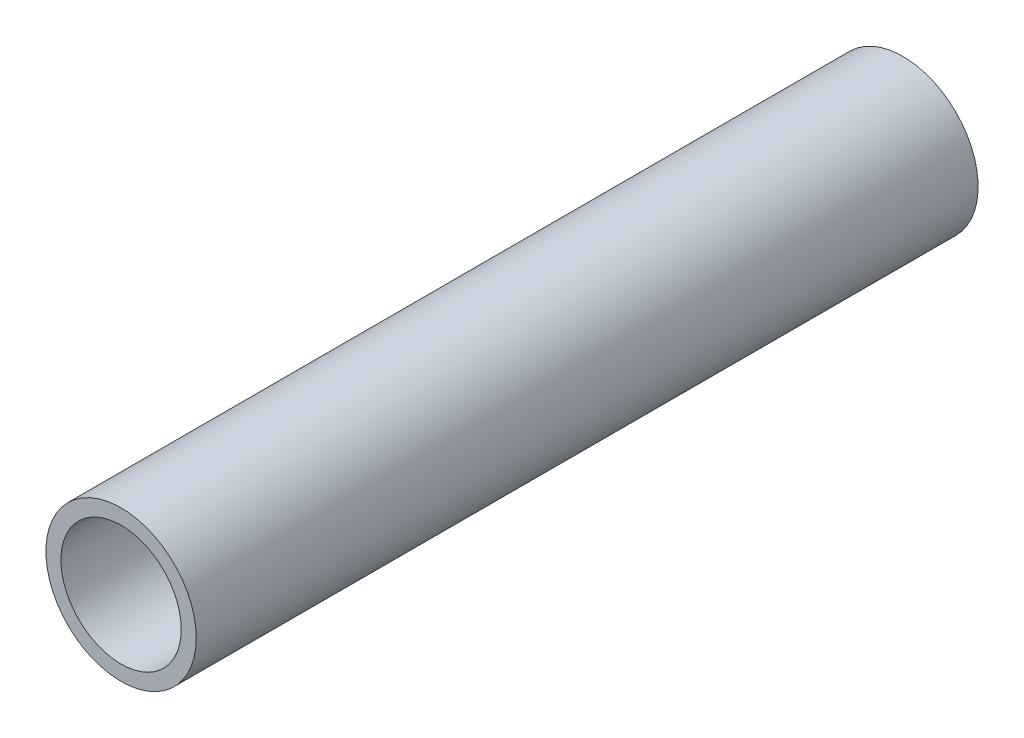
ISO-10303-21;
HEADER;
FILE_DESCRIPTION(('STEP AP214'),'2;1');
FILE_NAME('part.step','',(''),(''),'','','');
FILE_SCHEMA(('AUTOMOTIVE_DESIGN { 1 0 10303 214 1 1 1 1 }'));
ENDSEC;
DATA;
#1=APPLICATION_CONTEXT('core data for automotive mechanical design processes');
#2=APPLICATION_PROTOCOL_DEFINITION('international standard','automotive_design',2000,#1);
#3=PRODUCT_CONTEXT('',#1,'mechanical');
#4=PRODUCT('Part','Part','',(#3));
#5=PRODUCT_RELATED_PRODUCT_CATEGORY('part','',(#4));
#6=PRODUCT_DEFINITION_FORMATION('','',#4);
#7=PRODUCT_DEFINITION_CONTEXT('part definition',#1,'design');
#8=PRODUCT_DEFINITION('design','',#6,#7);
#9=PRODUCT_DEFINITION_SHAPE('','',#8);
#10=(LENGTH_UNIT() NAMED_UNIT(*) SI_UNIT(.MILLI.,.METRE.));
#11=(NAMED_UNIT(*) PLANE_ANGLE_UNIT() SI_UNIT($,.RADIAN.));
#12=(NAMED_UNIT(*) SI_UNIT($,.STERADIAN.) SOLID_ANGLE_UNIT());
#13=UNCERTAINTY_MEASURE_WITH_UNIT(LENGTH_MEASURE(1.E-05),#10,'distance_accuracy_value','');
#14=(GEOMETRIC_REPRESENTATION_CONTEXT(3) GLOBAL_UNCERTAINTY_ASSIGNED_CONTEXT((#13)) GLOBAL_UNIT_ASSIGNED_CONTEXT((#10,
#11,#12)) REPRESENTATION_CONTEXT('',''));
#15=CARTESIAN_POINT('',(0.,0.,0.));
#16=DIRECTION('',(0.,0.,1.));
#17=DIRECTION('',(1.,0.,0.));
#18=AXIS2_PLACEMENT_3D('',#15,#16,#17);
#19=CARTESIAN_POINT('',(0.,0.,0.));
#20=DIRECTION('',(0.,0.,1.));
#21=DIRECTION('',(1.,0.,0.));
#22=AXIS2_PLACEMENT_3D('',#19,#20,#21);
#23=PLANE('',#22);
#24=DIRECTION('',(-1.,0.,0.));
#25=VECTOR('',#24,1.);
#26=CARTESIAN_POINT('',(5.,-11.4564392373896,0.));
#27=LINE('',#26,#25);
#28=CARTESIAN_POINT('',(5.,-11.4564392373896,0.));
#29=VERTEX_POINT('',#28);
#30=CARTESIAN_POINT('',(-5.,-11.4564392373896,0.));
#31=VERTEX_POINT('',#30);
#32=EDGE_CURVE('E227',#29,#31,#27,.T.);
#33=ORIENTED_EDGE('',*,*,#32,.F.);
#34=CARTESIAN_POINT('',(0.,0.,0.));
#35=DIRECTION('',(0.,0.,1.));
#36=DIRECTION('',(1.,0.,0.));
#37=AXIS2_PLACEMENT_3D('',#34,#35,#36);
#38=CIRCLE('',#37,12.5);
#39=EDGE_CURVE('E224',#31,#29,#38,.T.);
#40=ORIENTED_EDGE('',*,*,#39,.F.);
#41=EDGE_LOOP('',(#33,#40));
#42=FACE_BOUND('',#41,.T.);
#43=ADVANCED_FACE('F40',(#42),#23,.F.);
#44=DIRECTION('',(-1.,0.,0.));
#45=VECTOR('',#44,1.);
#46=CARTESIAN_POINT('',(5.,11.4564392373896,0.));
#47=LINE('',#46,#45);
#48=CARTESIAN_POINT('',(-5.,11.4564392373896,0.));
#49=VERTEX_POINT('',#48);
#50=CARTESIAN_POINT('',(5.,11.4564392373896,0.));
#51=VERTEX_POINT('',#50);
#52=EDGE_CURVE('E230',#49,#51,#47,.F.);
#53=ORIENTED_EDGE('',*,*,#52,.F.);
#54=EDGE_CURVE('E218',#51,#49,#38,.T.);
#55=ORIENTED_EDGE('',*,*,#54,.F.);
#56=EDGE_LOOP('',(#53,#55));
#57=FACE_BOUND('',#56,.T.);
#58=ADVANCED_FACE('F180',(#57),#23,.F.);
#59=CARTESIAN_POINT('',(0.,0.,130.));
#60=DIRECTION('',(0.,0.,1.));
#61=DIRECTION('',(1.,0.,0.));
#62=AXIS2_PLACEMENT_3D('',#59,#60,#61);
#63=PLANE('',#62);
#64=CARTESIAN_POINT('',(0.,0.,130.));
#65=DIRECTION('',(0.,0.,1.));
#66=DIRECTION('',(1.,0.,0.));
#67=AXIS2_PLACEMENT_3D('',#64,#65,#66);
#68=CIRCLE('',#67,12.5);
#69=CARTESIAN_POINT('',(12.5,0.,130.));
#70=VERTEX_POINT('',#69);
#71=EDGE_CURVE('E111',#70,#70,#68,.T.);
#72=ORIENTED_EDGE('',*,*,#71,.T.);
#73=EDGE_LOOP('',(#72));
#74=FACE_BOUND('',#73,.T.);
#75=CARTESIAN_POINT('',(0.,0.,130.));
#76=DIRECTION('',(0.,0.,1.));
#77=DIRECTION('',(1.,0.,0.));
#78=AXIS2_PLACEMENT_3D('',#75,#76,#77);
#79=CIRCLE('',#78,10.);
#80=CARTESIAN_POINT('',(10.,0.,130.));
#81=VERTEX_POINT('',#80);
#82=EDGE_CURVE('E209',#81,#81,#79,.T.);
#83=ORIENTED_EDGE('',*,*,#82,.F.);
#84=EDGE_LOOP('',(#83));
#85=FACE_BOUND('',#84,.T.);
#86=ADVANCED_FACE('F187',(#74,#85),#63,.T.);
#87=EDGE_CURVE('E203',#29,#51,#38,.T.);
#88=ORIENTED_EDGE('',*,*,#87,.F.);
#89=DIRECTION('',(0.,1.,0.));
#90=VECTOR('',#89,1.);
#91=CARTESIAN_POINT('',(5.,0.,0.));
#92=LINE('',#91,#90);
#93=CARTESIAN_POINT('',(5.,-10.9087121146357,0.));
#94=VERTEX_POINT('',#93);
#95=EDGE_CURVE('E210',#29,#94,#92,.T.);
#96=ORIENTED_EDGE('',*,*,#95,.T.);
#97=DIRECTION('',(-1.,0.,0.));
#98=VECTOR('',#97,1.);
#99=CARTESIAN_POINT('',(5.,-10.9087121146357,0.));
#100=LINE('',#99,#98);
#101=CARTESIAN_POINT('',(-5.,-10.9087121146357,0.));
#102=VERTEX_POINT('',#101);
#103=EDGE_CURVE('E233',#94,#102,#100,.T.);
#104=ORIENTED_EDGE('',*,*,#103,.T.);
#105=DIRECTION('',(0.,1.,0.));
#106=VECTOR('',#105,1.);
#107=CARTESIAN_POINT('',(-5.,0.,0.));
#108=LINE('',#107,#106);
#109=EDGE_CURVE('E248',#31,#102,#108,.T.);
#110=ORIENTED_EDGE('',*,*,#109,.F.);
#111=EDGE_CURVE('E220',#49,#31,#38,.T.);
#112=ORIENTED_EDGE('',*,*,#111,.F.);
#113=CARTESIAN_POINT('',(-5.,10.9087121146357,0.));
#114=VERTEX_POINT('',#113);
#115=EDGE_CURVE('E247',#114,#49,#108,.T.);
#116=ORIENTED_EDGE('',*,*,#115,.F.);
#117=DIRECTION('',(-1.,0.,0.));
#118=VECTOR('',#117,1.);
#119=CARTESIAN_POINT('',(5.,10.9087121146357,0.));
#120=LINE('',#119,#118);
#121=CARTESIAN_POINT('',(5.,10.9087121146357,0.));
#122=VERTEX_POINT('',#121);
#123=EDGE_CURVE('E118',#114,#122,#120,.F.);
#124=ORIENTED_EDGE('',*,*,#123,.T.);
#125=EDGE_CURVE('E214',#122,#51,#92,.T.);
#126=ORIENTED_EDGE('',*,*,#125,.T.);
#127=EDGE_LOOP('',(#88,#96,#104,#110,#112,#116,#124,#126));
#128=FACE_BOUND('',#127,.T.);
#129=CARTESIAN_POINT('',(0.,0.,0.));
#130=DIRECTION('',(0.,0.,1.));
#131=DIRECTION('',(1.,0.,0.));
#132=AXIS2_PLACEMENT_3D('',#129,#130,#131);
#133=CIRCLE('',#132,10.);
#134=CARTESIAN_POINT('',(10.,0.,0.));
#135=VERTEX_POINT('',#134);
#136=EDGE_CURVE('E207',#135,#135,#133,.T.);
#137=ORIENTED_EDGE('',*,*,#136,.T.);
#138=EDGE_LOOP('',(#137));
#139=FACE_BOUND('',#138,.T.);
#140=ADVANCED_FACE('F182',(#128,#139),#23,.F.);
#141=CARTESIAN_POINT('',(0.,0.,130.));
#142=DIRECTION('',(0.,0.,-1.));
#143=DIRECTION('',(-1.,0.,0.));
#144=AXIS2_PLACEMENT_3D('',#141,#142,#143);
#145=CYLINDRICAL_SURFACE('',#144,12.5);
#146=ORIENTED_EDGE('',*,*,#71,.F.);
#147=EDGE_LOOP('',(#146));
#148=FACE_BOUND('',#147,.T.);
#149=ORIENTED_EDGE('',*,*,#54,.T.);
#150=ORIENTED_EDGE('',*,*,#111,.T.);
#151=ORIENTED_EDGE('',*,*,#39,.T.);
#152=ORIENTED_EDGE('',*,*,#87,.T.);
#153=EDGE_LOOP('',(#149,#150,#151,#152));
#154=FACE_BOUND('',#153,.T.);
#155=ADVANCED_FACE('F42',(#148,#154),#145,.T.);
#156=CARTESIAN_POINT('',(0.,0.,130.));
#157=DIRECTION('',(0.,0.,-1.));
#158=DIRECTION('',(-1.,0.,0.));
#159=AXIS2_PLACEMENT_3D('',#156,#157,#158);
#160=CYLINDRICAL_SURFACE('',#159,10.);
#161=DIRECTION('',(0.,0.,-1.));
#162=VECTOR('',#161,1.);
#163=CARTESIAN_POINT('',(5.,-8.66025403784439,130.));
#164=LINE('',#163,#162);
#165=CARTESIAN_POINT('',(5.,-8.66025403784439,4.01387818865998));
#166=VERTEX_POINT('',#165);
#167=CARTESIAN_POINT('',(5.,-8.66025403784439,3.30662386291809));
#168=VERTEX_POINT('',#167);
#169=EDGE_CURVE('E11',#166,#168,#164,.T.);
#170=ORIENTED_EDGE('',*,*,#169,.F.);
#171=CARTESIAN_POINT('',(5.,-8.66025403784439,4.01387818865998));
#172=CARTESIAN_POINT('',(4.82008154669658,-8.76410176369815,3.91413592086407));
#173=CARTESIAN_POINT('',(4.63627417539552,-8.86277482125367,3.81585166590048));
#174=CARTESIAN_POINT('',(4.26046253513023,-9.04945777136054,3.62410025880277));
#175=CARTESIAN_POINT('',(4.06844552469419,-9.13745021024587,3.53064113108571));
#176=CARTESIAN_POINT('',(3.6735444726537,-9.30330897296587,3.34947749360588));
#177=CARTESIAN_POINT('',(3.47054355256306,-9.38101073590016,3.261875562806));
#178=CARTESIAN_POINT('',(3.05636570597246,-9.52400065181224,3.09662511759068));
#179=CARTESIAN_POINT('',(2.84519369370649,-9.58929613065176,3.01897073806763));
#180=CARTESIAN_POINT('',(2.45759172326591,-9.69495715150847,2.89070882646823));
#181=CARTESIAN_POINT('',(2.28257576350106,-9.73769870382435,2.83779145738118));
#182=CARTESIAN_POINT('',(1.92789991719416,-9.81407601235486,2.74194234819441));
#183=CARTESIAN_POINT('',(1.74824141347055,-9.84771444652488,2.69900767191055));
#184=CARTESIAN_POINT('',(1.38603690819082,-9.90516637226989,2.62495067166923));
#185=CARTESIAN_POINT('',(1.20351357473872,-9.9290354830804,2.59376156081113));
#186=CARTESIAN_POINT('',(0.835691234393977,-9.96673401065602,2.5442157237096));
#187=CARTESIAN_POINT('',(0.650392381936918,-9.98056398391694,2.52585828617483));
#188=CARTESIAN_POINT('',(0.277023404493003,-9.99792199178797,2.5027843082056));
#189=CARTESIAN_POINT('',(0.0889429239281124,-10.0013703258567,2.49817330267363));
#190=CARTESIAN_POINT('',(-0.286921145275954,-9.99764976573475,2.50313315517893));
#191=CARTESIAN_POINT('',(-0.47470473425075,-9.99048088355496,2.51270399717288));
#192=CARTESIAN_POINT('',(-0.848836131892829,-9.96567705903095,2.54557479353535));
#193=CARTESIAN_POINT('',(-1.03517905304104,-9.94801545212216,2.56890972471664));
#194=CARTESIAN_POINT('',(-1.40458264038537,-9.90261584476655,2.62820964455827));
#195=CARTESIAN_POINT('',(-1.58764287161266,-9.87487651918632,2.66417629416033));
#196=CARTESIAN_POINT('',(-1.99220039244543,-9.80218125114327,2.75702829331244));
#197=CARTESIAN_POINT('',(-2.212570526093,-9.75470693497974,2.81684746936268));
#198=CARTESIAN_POINT('',(-2.64569626586319,-9.64625293380525,2.95029419175834));
#199=CARTESIAN_POINT('',(-2.85844806127138,-9.58526659670148,3.02392853669439));
#200=CARTESIAN_POINT('',(-3.27602095974102,-9.45070697696877,3.1819873617082));
#201=CARTESIAN_POINT('',(-3.48083355248731,-9.3771206218453,3.26642302488913));
#202=CARTESIAN_POINT('',(-3.8821672859035,-9.21820724995446,3.44326821578854));
#203=CARTESIAN_POINT('',(-4.07869125246977,-9.13288427760636,3.53567499260131));
#204=CARTESIAN_POINT('',(-4.39626872624612,-8.98287114444208,3.69283390198644));
#205=CARTESIAN_POINT('',(-4.51967617717792,-8.92140308246234,3.75595336297526));
#206=CARTESIAN_POINT('',(-4.76259961156356,-8.79410867130701,3.88379276030672));
#207=CARTESIAN_POINT('',(-4.88212937403474,-8.7283010532962,3.94850514814532));
#208=CARTESIAN_POINT('',(-5.,-8.66025403784439,4.01387818865998));
#209=B_SPLINE_CURVE_WITH_KNOTS('',3,(#171,#172,#173,#174,#175,#176,#177,#178,#179,#180,#181,
#182,#183,#184,#185,#186,#187,#188,#189,#190,#191,#192,#193,#194,#195,#196,#197,#198,#199,#200,
#201,#202,#203,#204,#205,#206,#207,#208),.UNSPECIFIED.,.F.,.F.,(4,2,2,2,2,2,2,2,2,2,2,2,2,2,2,2,
2,2,4),(0.,0.69134185195664,1.38379866559424,2.08625412807711,2.78829349541357,3.35112627895847,
3.91379330791225,4.47321081224863,5.03259730423152,5.59626743096089,6.15993692003427,
6.72504499459298,7.29022740291805,7.98882324195091,8.68776377342104,9.38743389753086,
10.0868635176567,10.5416445831123,10.9945770557237),.UNSPECIFIED.);
#210=CARTESIAN_POINT('',(-5.,-8.66025403784439,4.01387818865998));
#211=VERTEX_POINT('',#210);
#212=EDGE_CURVE('E48',#166,#211,#209,.T.);
#213=ORIENTED_EDGE('',*,*,#212,.T.);
#214=DIRECTION('',(0.,0.,-1.));
#215=VECTOR('',#214,1.);
#216=CARTESIAN_POINT('',(-5.,-8.66025403784439,130.));
#217=LINE('',#216,#215);
#218=CARTESIAN_POINT('',(-5.,-8.66025403784439,3.30662386291809));
#219=VERTEX_POINT('',#218);
#220=EDGE_CURVE('E161',#211,#219,#217,.T.);
#221=ORIENTED_EDGE('',*,*,#220,.T.);
#222=CARTESIAN_POINT('',(5.,-8.66025403784439,3.30662386291809));
#223=CARTESIAN_POINT('',(4.82516195453835,-8.76116069084542,3.20145819449252));
#224=CARTESIAN_POINT('',(4.64670456953597,-8.85716824931581,3.09749019690898));
#225=CARTESIAN_POINT('',(4.28196806230545,-9.03916673113265,2.89379473618386));
#226=CARTESIAN_POINT('',(4.09567653506668,-9.12514088708734,2.7940745434685));
#227=CARTESIAN_POINT('',(3.71197846270354,-9.2879124620808,2.59941343214978));
#228=CARTESIAN_POINT('',(3.51443553045838,-9.3645257756442,2.50458478071014));
#229=CARTESIAN_POINT('',(3.11122082111523,-9.50610425689325,2.32441795655837));
#230=CARTESIAN_POINT('',(2.90555407478053,-9.57107649959322,2.23907403143839));
#231=CARTESIAN_POINT('',(2.37075207397386,-9.72075056001072,2.03777130738266));
#232=CARTESIAN_POINT('',(2.03558507074427,-9.79682027068555,1.93058217472069));
#233=CARTESIAN_POINT('',(1.5213703952629,-9.88511623587745,1.8034648251444));
#234=CARTESIAN_POINT('',(1.34855608837977,-9.91021214838895,1.76675976869337));
#235=CARTESIAN_POINT('',(0.999704620471367,-9.95145121853615,1.7059655811073));
#236=CARTESIAN_POINT('',(0.823669314534956,-9.96759937164545,1.68186941093525));
#237=CARTESIAN_POINT('',(0.467635326863674,-9.99067050076046,1.64732651345713));
#238=CARTESIAN_POINT('',(0.287614336625661,-9.99748748906368,1.63703662991513));
#239=CARTESIAN_POINT('',(-0.0727722623708239,-10.00135854973,1.6312020327988));
#240=CARTESIAN_POINT('',(-0.253137862251725,-9.99841287029076,1.63565694436545));
#241=CARTESIAN_POINT('',(-0.612874353371959,-9.98282890827139,1.65907798957395));
#242=CARTESIAN_POINT('',(-0.792242295542281,-9.9701699277578,1.67807511079688));
#243=CARTESIAN_POINT('',(-1.14809702262394,-9.93548462910008,1.72956885388207));
#244=CARTESIAN_POINT('',(-1.32458337019914,-9.91345690254543,1.7620675054223));
#245=CARTESIAN_POINT('',(-1.7063215922141,-9.85557726879622,1.84621536728624));
#246=CARTESIAN_POINT('',(-1.91075453125975,-9.81790657135515,1.90031423909943));
#247=CARTESIAN_POINT('',(-2.31295681180807,-9.7310131568273,2.02231975942194));
#248=CARTESIAN_POINT('',(-2.51072265466896,-9.68178447922532,2.09023352992984));
#249=CARTESIAN_POINT('',(-2.89963018636716,-9.57251588397589,2.23708015886136));
#250=CARTESIAN_POINT('',(-3.09075277069538,-9.51244744005011,2.31604196542784));
#251=CARTESIAN_POINT('',(-3.46577487631518,-9.38231228907412,2.48220302473785));
#252=CARTESIAN_POINT('',(-3.64967594573687,-9.312247740051,2.56940049813991));
#253=CARTESIAN_POINT('',(-4.03453037500339,-9.15268290085556,2.76182798685031));
#254=CARTESIAN_POINT('',(-4.23449404591816,-9.06183691476438,2.8679131449105));
#255=CARTESIAN_POINT('',(-4.62429787880892,-8.86919237640821,3.08445929666655));
#256=CARTESIAN_POINT('',(-4.81420314802685,-8.76748182146515,3.19488114407875));
#257=CARTESIAN_POINT('',(-5.,-8.66025403784439,3.30662386291809));
#258=B_SPLINE_CURVE_WITH_KNOTS('',3,(#222,#223,#224,#225,#226,#227,#228,#229,#230,#231,#232,
#233,#234,#235,#236,#237,#238,#239,#240,#241,#242,#243,#244,#245,#246,#247,#248,#249,#250,#251,
#252,#253,#254,#255,#256,#257),.UNSPECIFIED.,.F.,.F.,(4,2,2,2,2,2,2,2,2,2,2,2,2,2,2,2,2,4),(0.,
0.682849222875357,1.36682373036994,2.06260941823753,2.75797078804695,3.83347678621021,
4.368234306975,4.90269297464555,5.44317325993766,5.98363980462794,6.52526123100374,
7.06696410852381,7.7103501516929,8.3540687242987,8.99950670982,9.64480556406332,
10.3760225965909,11.1017114061016),.UNSPECIFIED.);
#259=EDGE_CURVE('E154',#168,#219,#258,.T.);
#260=ORIENTED_EDGE('',*,*,#259,.F.);
#261=EDGE_LOOP('',(#170,#213,#221,#260));
#262=FACE_BOUND('',#261,.T.);
#263=DIRECTION('',(0.,0.,-1.));
#264=VECTOR('',#263,1.);
#265=CARTESIAN_POINT('',(5.,8.66025403784439,130.));
#266=LINE('',#265,#264);
#267=CARTESIAN_POINT('',(5.,8.66025403784439,3.30662386291809));
#268=VERTEX_POINT('',#267);
#269=CARTESIAN_POINT('',(5.,8.66025403784439,4.01387818865998));
#270=VERTEX_POINT('',#269);
#271=EDGE_CURVE('E125',#268,#270,#266,.F.);
#272=ORIENTED_EDGE('',*,*,#271,.F.);
#273=CARTESIAN_POINT('',(-5.,8.66025403784439,3.30662386291809));
#274=CARTESIAN_POINT('',(-4.82516195453835,8.76116069084542,3.20145819449252));
#275=CARTESIAN_POINT('',(-4.64670456953597,8.85716824931581,3.09749019690898));
#276=CARTESIAN_POINT('',(-4.28196806230545,9.03916673113265,2.89379473618386));
#277=CARTESIAN_POINT('',(-4.09567653506668,9.12514088708734,2.7940745434685));
#278=CARTESIAN_POINT('',(-3.71197846270354,9.2879124620808,2.59941343214978));
#279=CARTESIAN_POINT('',(-3.51443553045838,9.3645257756442,2.50458478071014));
#280=CARTESIAN_POINT('',(-3.11122082111523,9.50610425689325,2.32441795655837));
#281=CARTESIAN_POINT('',(-2.90555407478053,9.57107649959322,2.23907403143839));
#282=CARTESIAN_POINT('',(-2.37075207397386,9.72075056001072,2.03777130738266));
#283=CARTESIAN_POINT('',(-2.03558507074427,9.79682027068555,1.93058217472069));
#284=CARTESIAN_POINT('',(-1.5213703952629,9.88511623587745,1.8034648251444));
#285=CARTESIAN_POINT('',(-1.34855608837977,9.91021214838895,1.76675976869337));
#286=CARTESIAN_POINT('',(-0.999704620471367,9.95145121853615,1.7059655811073));
#287=CARTESIAN_POINT('',(-0.823669314534956,9.96759937164545,1.68186941093525));
#288=CARTESIAN_POINT('',(-0.467635326863674,9.99067050076046,1.64732651345713));
#289=CARTESIAN_POINT('',(-0.287614336625661,9.99748748906368,1.63703662991513));
#290=CARTESIAN_POINT('',(0.0727722623708239,10.00135854973,1.6312020327988));
#291=CARTESIAN_POINT('',(0.253137862251725,9.99841287029076,1.63565694436545));
#292=CARTESIAN_POINT('',(0.612874353371959,9.98282890827139,1.65907798957395));
#293=CARTESIAN_POINT('',(0.792242295542281,9.9701699277578,1.67807511079688));
#294=CARTESIAN_POINT('',(1.14809702262394,9.93548462910008,1.72956885388207));
#295=CARTESIAN_POINT('',(1.32458337019914,9.91345690254543,1.7620675054223));
#296=CARTESIAN_POINT('',(1.7063215922141,9.85557726879622,1.84621536728624));
#297=CARTESIAN_POINT('',(1.91075453125975,9.81790657135515,1.90031423909943));
#298=CARTESIAN_POINT('',(2.31295681180807,9.7310131568273,2.02231975942194));
#299=CARTESIAN_POINT('',(2.51072265466896,9.68178447922532,2.09023352992984));
#300=CARTESIAN_POINT('',(2.89963018636716,9.57251588397589,2.23708015886136));
#301=CARTESIAN_POINT('',(3.09075277069538,9.51244744005011,2.31604196542784));
#302=CARTESIAN_POINT('',(3.46577487631518,9.38231228907412,2.48220302473785));
#303=CARTESIAN_POINT('',(3.64967594573687,9.312247740051,2.56940049813991));
#304=CARTESIAN_POINT('',(4.03453037500339,9.15268290085556,2.76182798685031));
#305=CARTESIAN_POINT('',(4.23449404591816,9.06183691476438,2.8679131449105));
#306=CARTESIAN_POINT('',(4.62429787880892,8.86919237640821,3.08445929666655));
#307=CARTESIAN_POINT('',(4.81420314802685,8.76748182146515,3.19488114407875));
#308=CARTESIAN_POINT('',(5.,8.66025403784439,3.30662386291809));
#309=B_SPLINE_CURVE_WITH_KNOTS('',3,(#273,#274,#275,#276,#277,#278,#279,#280,#281,#282,#283,
#284,#285,#286,#287,#288,#289,#290,#291,#292,#293,#294,#295,#296,#297,#298,#299,#300,#301,#302,
#303,#304,#305,#306,#307,#308),.UNSPECIFIED.,.F.,.F.,(4,2,2,2,2,2,2,2,2,2,2,2,2,2,2,2,2,4),(0.,
0.682849222875357,1.36682373036994,2.06260941823753,2.75797078804695,3.83347678621021,
4.368234306975,4.90269297464555,5.44317325993766,5.98363980462794,6.52526123100374,
7.06696410852381,7.7103501516929,8.3540687242987,8.99950670982,9.64480556406332,
10.3760225965909,11.1017114061016),.UNSPECIFIED.);
#310=CARTESIAN_POINT('',(-5.,8.66025403784439,3.30662386291809));
#311=VERTEX_POINT('',#310);
#312=EDGE_CURVE('E110',#311,#268,#309,.T.);
#313=ORIENTED_EDGE('',*,*,#312,.F.);
#314=DIRECTION('',(0.,0.,-1.));
#315=VECTOR('',#314,1.);
#316=CARTESIAN_POINT('',(-5.,8.66025403784439,130.));
#317=LINE('',#316,#315);
#318=CARTESIAN_POINT('',(-5.,8.66025403784439,4.01387818865998));
#319=VERTEX_POINT('',#318);
#320=EDGE_CURVE('E102',#311,#319,#317,.F.);
#321=ORIENTED_EDGE('',*,*,#320,.T.);
#322=CARTESIAN_POINT('',(-5.,8.66025403784439,4.01387818865998));
#323=CARTESIAN_POINT('',(-4.82008154669658,8.76410176369815,3.91413592086407));
#324=CARTESIAN_POINT('',(-4.63627417539552,8.86277482125367,3.81585166590048));
#325=CARTESIAN_POINT('',(-4.26046253513023,9.04945777136054,3.62410025880277));
#326=CARTESIAN_POINT('',(-4.06844552469419,9.13745021024587,3.53064113108571));
#327=CARTESIAN_POINT('',(-3.6735444726537,9.30330897296587,3.34947749360588));
#328=CARTESIAN_POINT('',(-3.47054355256306,9.38101073590016,3.261875562806));
#329=CARTESIAN_POINT('',(-3.05636570597246,9.52400065181224,3.09662511759068));
#330=CARTESIAN_POINT('',(-2.84519369370649,9.58929613065176,3.01897073806763));
#331=CARTESIAN_POINT('',(-2.45759172326591,9.69495715150847,2.89070882646823));
#332=CARTESIAN_POINT('',(-2.28257576350106,9.73769870382435,2.83779145738118));
#333=CARTESIAN_POINT('',(-1.92789991719416,9.81407601235486,2.74194234819441));
#334=CARTESIAN_POINT('',(-1.74824141347055,9.84771444652488,2.69900767191055));
#335=CARTESIAN_POINT('',(-1.38603690819082,9.90516637226989,2.62495067166923));
#336=CARTESIAN_POINT('',(-1.20351357473872,9.9290354830804,2.59376156081113));
#337=CARTESIAN_POINT('',(-0.835691234393977,9.96673401065602,2.5442157237096));
#338=CARTESIAN_POINT('',(-0.650392381936918,9.98056398391694,2.52585828617483));
#339=CARTESIAN_POINT('',(-0.277023404493003,9.99792199178797,2.5027843082056));
#340=CARTESIAN_POINT('',(-0.0889429239281124,10.0013703258567,2.49817330267363));
#341=CARTESIAN_POINT('',(0.286921145275954,9.99764976573475,2.50313315517893));
#342=CARTESIAN_POINT('',(0.47470473425075,9.99048088355496,2.51270399717288));
#343=CARTESIAN_POINT('',(0.848836131892829,9.96567705903095,2.54557479353535));
#344=CARTESIAN_POINT('',(1.03517905304104,9.94801545212216,2.56890972471664));
#345=CARTESIAN_POINT('',(1.40458264038537,9.90261584476655,2.62820964455827));
#346=CARTESIAN_POINT('',(1.58764287161266,9.87487651918632,2.66417629416033));
#347=CARTESIAN_POINT('',(1.99220039244543,9.80218125114327,2.75702829331244));
#348=CARTESIAN_POINT('',(2.212570526093,9.75470693497974,2.81684746936268));
#349=CARTESIAN_POINT('',(2.64569626586319,9.64625293380525,2.95029419175834));
#350=CARTESIAN_POINT('',(2.85844806127138,9.58526659670148,3.02392853669439));
#351=CARTESIAN_POINT('',(3.27602095974102,9.45070697696877,3.1819873617082));
#352=CARTESIAN_POINT('',(3.48083355248731,9.3771206218453,3.26642302488913));
#353=CARTESIAN_POINT('',(3.8821672859035,9.21820724995446,3.44326821578854));
#354=CARTESIAN_POINT('',(4.07869125246977,9.13288427760636,3.53567499260131));
#355=CARTESIAN_POINT('',(4.39626872624612,8.98287114444208,3.69283390198644));
#356=CARTESIAN_POINT('',(4.51967617717792,8.92140308246234,3.75595336297526));
#357=CARTESIAN_POINT('',(4.76259961156356,8.79410867130701,3.88379276030672));
#358=CARTESIAN_POINT('',(4.88212937403474,8.7283010532962,3.94850514814532));
#359=CARTESIAN_POINT('',(5.,8.66025403784439,4.01387818865998));
#360=B_SPLINE_CURVE_WITH_KNOTS('',3,(#322,#323,#324,#325,#326,#327,#328,#329,#330,#331,#332,
#333,#334,#335,#336,#337,#338,#339,#340,#341,#342,#343,#344,#345,#346,#347,#348,#349,#350,#351,
#352,#353,#354,#355,#356,#357,#358,#359),.UNSPECIFIED.,.F.,.F.,(4,2,2,2,2,2,2,2,2,2,2,2,2,2,2,2,
2,2,4),(0.,0.69134185195664,1.38379866559424,2.08625412807711,2.78829349541357,3.35112627895847,
3.91379330791225,4.47321081224863,5.03259730423152,5.59626743096089,6.15993692003427,
6.72504499459298,7.29022740291805,7.98882324195091,8.68776377342104,9.38743389753086,
10.0868635176567,10.5416445831123,10.9945770557237),.UNSPECIFIED.);
#361=EDGE_CURVE('E126',#319,#270,#360,.T.);
#362=ORIENTED_EDGE('',*,*,#361,.T.);
#363=EDGE_LOOP('',(#272,#313,#321,#362));
#364=FACE_BOUND('',#363,.T.);
#365=ORIENTED_EDGE('',*,*,#82,.T.);
#366=EDGE_LOOP('',(#365));
#367=FACE_BOUND('',#366,.T.);
#368=ORIENTED_EDGE('',*,*,#136,.F.);
#369=EDGE_LOOP('',(#368));
#370=FACE_BOUND('',#369,.T.);
#371=ADVANCED_FACE('F123',(#262,#364,#367,#370),#160,.F.);
#372=CARTESIAN_POINT('',(-5.,0.,-5.));
#373=DIRECTION('',(1.,0.,0.));
#374=DIRECTION('',(0.,0.,-1.));
#375=AXIS2_PLACEMENT_3D('',#372,#373,#374);
#376=PLANE('',#375);
#377=ORIENTED_EDGE('',*,*,#115,.T.);
#378=CARTESIAN_POINT('',(-5.,0.,-5.));
#379=DIRECTION('',(1.,0.,0.));
#380=DIRECTION('',(0.,0.,-1.));
#381=AXIS2_PLACEMENT_3D('',#378,#379,#380);
#382=CIRCLE('',#381,12.5);
#383=EDGE_CURVE('E105',#49,#319,#382,.T.);
#384=ORIENTED_EDGE('',*,*,#383,.T.);
#385=ORIENTED_EDGE('',*,*,#320,.F.);
#386=CARTESIAN_POINT('',(-5.,0.,-5.));
#387=DIRECTION('',(1.,0.,0.));
#388=DIRECTION('',(0.,0.,-1.));
#389=AXIS2_PLACEMENT_3D('',#386,#387,#388);
#390=CIRCLE('',#389,12.);
#391=EDGE_CURVE('E55',#114,#311,#390,.T.);
#392=ORIENTED_EDGE('',*,*,#391,.F.);
#393=EDGE_LOOP('',(#377,#384,#385,#392));
#394=FACE_BOUND('',#393,.T.);
#395=ADVANCED_FACE('F103',(#394),#376,.T.);
#396=CARTESIAN_POINT('',(5.,0.,-5.));
#397=DIRECTION('',(-1.,0.,0.));
#398=DIRECTION('',(0.,0.,1.));
#399=AXIS2_PLACEMENT_3D('',#396,#397,#398);
#400=CYLINDRICAL_SURFACE('',#399,12.);
#401=ORIENTED_EDGE('',*,*,#391,.T.);
#402=ORIENTED_EDGE('',*,*,#312,.T.);
#403=CARTESIAN_POINT('',(5.,0.,-5.));
#404=DIRECTION('',(1.,0.,0.));
#405=DIRECTION('',(0.,0.,-1.));
#406=AXIS2_PLACEMENT_3D('',#403,#404,#405);
#407=CIRCLE('',#406,12.);
#408=EDGE_CURVE('E237',#122,#268,#407,.T.);
#409=ORIENTED_EDGE('',*,*,#408,.F.);
#410=ORIENTED_EDGE('',*,*,#123,.F.);
#411=EDGE_LOOP('',(#401,#402,#409,#410));
#412=FACE_BOUND('',#411,.T.);
#413=ADVANCED_FACE('F114',(#412),#400,.T.);
#414=CARTESIAN_POINT('',(5.,0.,-5.));
#415=DIRECTION('',(-1.,0.,0.));
#416=DIRECTION('',(0.,0.,1.));
#417=AXIS2_PLACEMENT_3D('',#414,#415,#416);
#418=CYLINDRICAL_SURFACE('',#417,12.5);
#419=ORIENTED_EDGE('',*,*,#52,.T.);
#420=CARTESIAN_POINT('',(5.,0.,-5.));
#421=DIRECTION('',(1.,0.,0.));
#422=DIRECTION('',(0.,0.,-1.));
#423=AXIS2_PLACEMENT_3D('',#420,#421,#422);
#424=CIRCLE('',#423,12.5);
#425=EDGE_CURVE('E239',#51,#270,#424,.T.);
#426=ORIENTED_EDGE('',*,*,#425,.T.);
#427=ORIENTED_EDGE('',*,*,#361,.F.);
#428=ORIENTED_EDGE('',*,*,#383,.F.);
#429=EDGE_LOOP('',(#419,#426,#427,#428));
#430=FACE_BOUND('',#429,.T.);
#431=ADVANCED_FACE('F148',(#430),#418,.F.);
#432=CARTESIAN_POINT('',(5.,0.,-5.));
#433=DIRECTION('',(1.,0.,0.));
#434=DIRECTION('',(0.,0.,-1.));
#435=AXIS2_PLACEMENT_3D('',#432,#433,#434);
#436=PLANE('',#435);
#437=ORIENTED_EDGE('',*,*,#408,.T.);
#438=ORIENTED_EDGE('',*,*,#271,.T.);
#439=ORIENTED_EDGE('',*,*,#425,.F.);
#440=ORIENTED_EDGE('',*,*,#125,.F.);
#441=EDGE_LOOP('',(#437,#438,#439,#440));
#442=FACE_BOUND('',#441,.T.);
#443=ADVANCED_FACE('F169',(#442),#436,.F.);
#444=EDGE_CURVE('E240',#166,#29,#424,.T.);
#445=ORIENTED_EDGE('',*,*,#444,.F.);
#446=ORIENTED_EDGE('',*,*,#169,.T.);
#447=EDGE_CURVE('E241',#168,#94,#407,.T.);
#448=ORIENTED_EDGE('',*,*,#447,.T.);
#449=ORIENTED_EDGE('',*,*,#95,.F.);
#450=EDGE_LOOP('',(#445,#446,#448,#449));
#451=FACE_BOUND('',#450,.T.);
#452=ADVANCED_FACE('F151',(#451),#436,.F.);
#453=ORIENTED_EDGE('',*,*,#32,.T.);
#454=EDGE_CURVE('E63',#211,#31,#382,.T.);
#455=ORIENTED_EDGE('',*,*,#454,.F.);
#456=ORIENTED_EDGE('',*,*,#212,.F.);
#457=ORIENTED_EDGE('',*,*,#444,.T.);
#458=EDGE_LOOP('',(#453,#455,#456,#457));
#459=FACE_BOUND('',#458,.T.);
#460=ADVANCED_FACE('F171',(#459),#418,.F.);
#461=ORIENTED_EDGE('',*,*,#447,.F.);
#462=ORIENTED_EDGE('',*,*,#259,.T.);
#463=EDGE_CURVE('E120',#219,#102,#390,.T.);
#464=ORIENTED_EDGE('',*,*,#463,.T.);
#465=ORIENTED_EDGE('',*,*,#103,.F.);
#466=EDGE_LOOP('',(#461,#462,#464,#465));
#467=FACE_BOUND('',#466,.T.);
#468=ADVANCED_FACE('F149',(#467),#400,.T.);
#469=ORIENTED_EDGE('',*,*,#109,.T.);
#470=ORIENTED_EDGE('',*,*,#463,.F.);
#471=ORIENTED_EDGE('',*,*,#220,.F.);
#472=ORIENTED_EDGE('',*,*,#454,.T.);
#473=EDGE_LOOP('',(#469,#470,#471,#472));
#474=FACE_BOUND('',#473,.T.);
#475=ADVANCED_FACE('F150',(#474),#376,.T.);
#476=CLOSED_SHELL('',(#43,#58,#86,#140,#155,#371,#395,#413,#431,#443,#452,#460,#468,#475));
#477=MANIFOLD_SOLID_BREP('B2',#476);
#478=ADVANCED_BREP_SHAPE_REPRESENTATION('',(#18,#477),#14);
#479=SHAPE_DEFINITION_REPRESENTATION(#9,#478);
ENDSEC;
END-ISO-10303-21;
